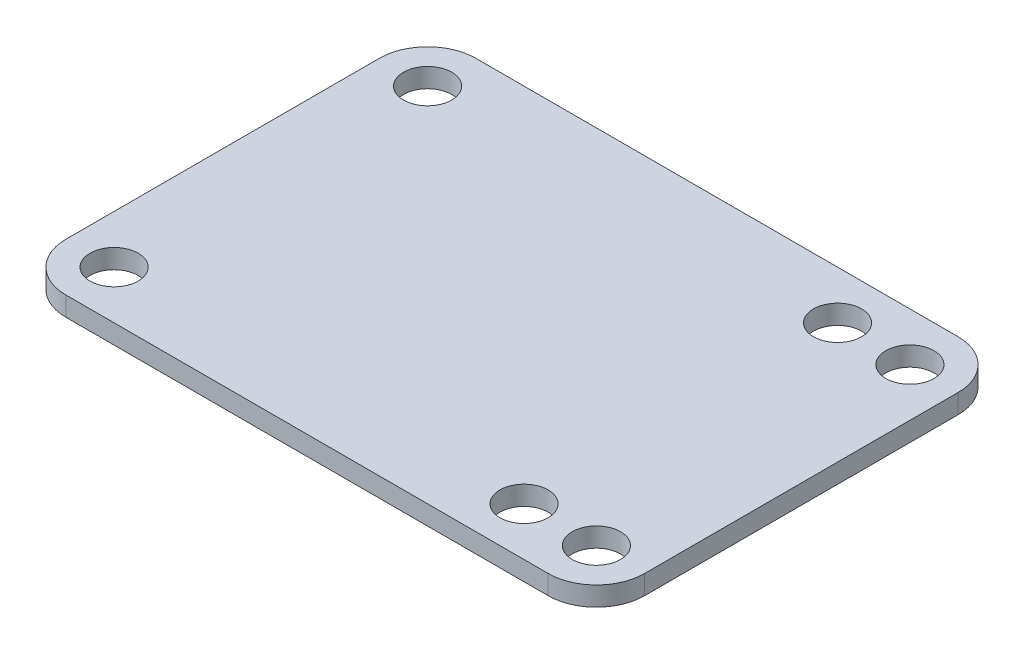
ISO-10303-21;
HEADER;
FILE_DESCRIPTION(('STEP AP214'),'2;1');
FILE_NAME('part.step','',(''),(''),'','','');
FILE_SCHEMA(('AUTOMOTIVE_DESIGN { 1 0 10303 214 1 1 1 1 }'));
ENDSEC;
DATA;
#1=APPLICATION_CONTEXT('core data for automotive mechanical design processes');
#2=APPLICATION_PROTOCOL_DEFINITION('international standard','automotive_design',2000,#1);
#3=PRODUCT_CONTEXT('',#1,'mechanical');
#4=PRODUCT('Part','Part','',(#3));
#5=PRODUCT_RELATED_PRODUCT_CATEGORY('part','',(#4));
#6=PRODUCT_DEFINITION_FORMATION('','',#4);
#7=PRODUCT_DEFINITION_CONTEXT('part definition',#1,'design');
#8=PRODUCT_DEFINITION('design','',#6,#7);
#9=PRODUCT_DEFINITION_SHAPE('','',#8);
#10=(LENGTH_UNIT() NAMED_UNIT(*) SI_UNIT(.MILLI.,.METRE.));
#11=(NAMED_UNIT(*) PLANE_ANGLE_UNIT() SI_UNIT($,.RADIAN.));
#12=(NAMED_UNIT(*) SI_UNIT($,.STERADIAN.) SOLID_ANGLE_UNIT());
#13=UNCERTAINTY_MEASURE_WITH_UNIT(LENGTH_MEASURE(1.E-05),#10,'distance_accuracy_value','');
#14=(GEOMETRIC_REPRESENTATION_CONTEXT(3) GLOBAL_UNCERTAINTY_ASSIGNED_CONTEXT((#13)) GLOBAL_UNIT_ASSIGNED_CONTEXT((#10,
#11,#12)) REPRESENTATION_CONTEXT('',''));
#15=CARTESIAN_POINT('',(0.,0.,0.));
#16=DIRECTION('',(0.,0.,1.));
#17=DIRECTION('',(1.,0.,0.));
#18=AXIS2_PLACEMENT_3D('',#15,#16,#17);
#19=CARTESIAN_POINT('',(-38.1,2.54,26.9875));
#20=DIRECTION('',(1.,0.,0.));
#21=DIRECTION('',(0.,0.,-1.));
#22=AXIS2_PLACEMENT_3D('',#19,#20,#21);
#23=PLANE('',#22);
#24=DIRECTION('',(0.,0.,1.));
#25=VECTOR('',#24,1.);
#26=CARTESIAN_POINT('',(-38.1,0.,26.9875));
#27=LINE('',#26,#25);
#28=CARTESIAN_POINT('',(-38.1,0.,-20.6375));
#29=VERTEX_POINT('',#28);
#30=CARTESIAN_POINT('',(-38.1,0.,20.6375));
#31=VERTEX_POINT('',#30);
#32=EDGE_CURVE('E126',#29,#31,#27,.T.);
#33=ORIENTED_EDGE('',*,*,#32,.T.);
#34=DIRECTION('',(0.,-1.,0.));
#35=VECTOR('',#34,1.);
#36=CARTESIAN_POINT('',(-38.1,2.54,20.6375));
#37=LINE('',#36,#35);
#38=CARTESIAN_POINT('',(-38.1,2.54,20.6375));
#39=VERTEX_POINT('',#38);
#40=EDGE_CURVE('E104',#31,#39,#37,.F.);
#41=ORIENTED_EDGE('',*,*,#40,.T.);
#42=DIRECTION('',(0.,0.,1.));
#43=VECTOR('',#42,1.);
#44=CARTESIAN_POINT('',(-38.1,2.54,26.9875));
#45=LINE('',#44,#43);
#46=CARTESIAN_POINT('',(-38.1,2.54,-20.6375));
#47=VERTEX_POINT('',#46);
#48=EDGE_CURVE('E136',#47,#39,#45,.T.);
#49=ORIENTED_EDGE('',*,*,#48,.F.);
#50=DIRECTION('',(0.,-1.,0.));
#51=VECTOR('',#50,1.);
#52=CARTESIAN_POINT('',(-38.1,2.54,-20.6375));
#53=LINE('',#52,#51);
#54=EDGE_CURVE('E109',#47,#29,#53,.T.);
#55=ORIENTED_EDGE('',*,*,#54,.T.);
#56=EDGE_LOOP('',(#33,#41,#49,#55));
#57=FACE_BOUND('',#56,.T.);
#58=ADVANCED_FACE('F33',(#57),#23,.F.);
#59=CARTESIAN_POINT('',(38.1,2.54,26.9875));
#60=DIRECTION('',(0.,0.,-1.));
#61=DIRECTION('',(-1.,0.,0.));
#62=AXIS2_PLACEMENT_3D('',#59,#60,#61);
#63=PLANE('',#62);
#64=DIRECTION('',(1.,0.,0.));
#65=VECTOR('',#64,1.);
#66=CARTESIAN_POINT('',(38.1,2.54,26.9875));
#67=LINE('',#66,#65);
#68=CARTESIAN_POINT('',(-31.75,2.54,26.9875));
#69=VERTEX_POINT('',#68);
#70=CARTESIAN_POINT('',(31.75,2.54,26.9875));
#71=VERTEX_POINT('',#70);
#72=EDGE_CURVE('E119',#69,#71,#67,.T.);
#73=ORIENTED_EDGE('',*,*,#72,.F.);
#74=DIRECTION('',(0.,-1.,0.));
#75=VECTOR('',#74,1.);
#76=CARTESIAN_POINT('',(-31.75,2.54,26.9875));
#77=LINE('',#76,#75);
#78=CARTESIAN_POINT('',(-31.75,0.,26.9875));
#79=VERTEX_POINT('',#78);
#80=EDGE_CURVE('E103',#69,#79,#77,.T.);
#81=ORIENTED_EDGE('',*,*,#80,.T.);
#82=DIRECTION('',(1.,0.,0.));
#83=VECTOR('',#82,1.);
#84=CARTESIAN_POINT('',(38.1,0.,26.9875));
#85=LINE('',#84,#83);
#86=CARTESIAN_POINT('',(31.75,0.,26.9875));
#87=VERTEX_POINT('',#86);
#88=EDGE_CURVE('E116',#79,#87,#85,.T.);
#89=ORIENTED_EDGE('',*,*,#88,.T.);
#90=DIRECTION('',(0.,-1.,0.));
#91=VECTOR('',#90,1.);
#92=CARTESIAN_POINT('',(31.75,2.54,26.9875));
#93=LINE('',#92,#91);
#94=EDGE_CURVE('E121',#87,#71,#93,.F.);
#95=ORIENTED_EDGE('',*,*,#94,.T.);
#96=EDGE_LOOP('',(#73,#81,#89,#95));
#97=FACE_BOUND('',#96,.T.);
#98=ADVANCED_FACE('F115',(#97),#63,.F.);
#99=CARTESIAN_POINT('',(38.1,2.54,-26.9875));
#100=DIRECTION('',(-1.,0.,0.));
#101=DIRECTION('',(0.,0.,1.));
#102=AXIS2_PLACEMENT_3D('',#99,#100,#101);
#103=PLANE('',#102);
#104=DIRECTION('',(0.,0.,-1.));
#105=VECTOR('',#104,1.);
#106=CARTESIAN_POINT('',(38.1,0.,-26.9875));
#107=LINE('',#106,#105);
#108=CARTESIAN_POINT('',(38.1,0.,20.6375));
#109=VERTEX_POINT('',#108);
#110=CARTESIAN_POINT('',(38.1,0.,-20.6375));
#111=VERTEX_POINT('',#110);
#112=EDGE_CURVE('E125',#109,#111,#107,.T.);
#113=ORIENTED_EDGE('',*,*,#112,.T.);
#114=DIRECTION('',(0.,-1.,0.));
#115=VECTOR('',#114,1.);
#116=CARTESIAN_POINT('',(38.1,2.54,-20.6375));
#117=LINE('',#116,#115);
#118=CARTESIAN_POINT('',(38.1,2.54,-20.6375));
#119=VERTEX_POINT('',#118);
#120=EDGE_CURVE('E11',#111,#119,#117,.F.);
#121=ORIENTED_EDGE('',*,*,#120,.T.);
#122=DIRECTION('',(0.,0.,-1.));
#123=VECTOR('',#122,1.);
#124=CARTESIAN_POINT('',(38.1,2.54,-26.9875));
#125=LINE('',#124,#123);
#126=CARTESIAN_POINT('',(38.1,2.54,20.6375));
#127=VERTEX_POINT('',#126);
#128=EDGE_CURVE('E162',#127,#119,#125,.T.);
#129=ORIENTED_EDGE('',*,*,#128,.F.);
#130=DIRECTION('',(0.,-1.,0.));
#131=VECTOR('',#130,1.);
#132=CARTESIAN_POINT('',(38.1,2.54,20.6375));
#133=LINE('',#132,#131);
#134=EDGE_CURVE('E41',#127,#109,#133,.T.);
#135=ORIENTED_EDGE('',*,*,#134,.T.);
#136=EDGE_LOOP('',(#113,#121,#129,#135));
#137=FACE_BOUND('',#136,.T.);
#138=ADVANCED_FACE('F160',(#137),#103,.F.);
#139=CARTESIAN_POINT('',(-38.1,2.54,-26.9875));
#140=DIRECTION('',(0.,0.,1.));
#141=DIRECTION('',(1.,0.,0.));
#142=AXIS2_PLACEMENT_3D('',#139,#140,#141);
#143=PLANE('',#142);
#144=DIRECTION('',(-1.,0.,0.));
#145=VECTOR('',#144,1.);
#146=CARTESIAN_POINT('',(-38.1,0.,-26.9875));
#147=LINE('',#146,#145);
#148=CARTESIAN_POINT('',(31.75,0.,-26.9875));
#149=VERTEX_POINT('',#148);
#150=CARTESIAN_POINT('',(-31.75,0.,-26.9875));
#151=VERTEX_POINT('',#150);
#152=EDGE_CURVE('E129',#149,#151,#147,.T.);
#153=ORIENTED_EDGE('',*,*,#152,.T.);
#154=DIRECTION('',(0.,-1.,0.));
#155=VECTOR('',#154,1.);
#156=CARTESIAN_POINT('',(-31.75,2.54,-26.9875));
#157=LINE('',#156,#155);
#158=CARTESIAN_POINT('',(-31.75,2.54,-26.9875));
#159=VERTEX_POINT('',#158);
#160=EDGE_CURVE('E48',#151,#159,#157,.F.);
#161=ORIENTED_EDGE('',*,*,#160,.T.);
#162=DIRECTION('',(-1.,0.,0.));
#163=VECTOR('',#162,1.);
#164=CARTESIAN_POINT('',(-38.1,2.54,-26.9875));
#165=LINE('',#164,#163);
#166=CARTESIAN_POINT('',(31.75,2.54,-26.9875));
#167=VERTEX_POINT('',#166);
#168=EDGE_CURVE('E137',#167,#159,#165,.T.);
#169=ORIENTED_EDGE('',*,*,#168,.F.);
#170=DIRECTION('',(0.,-1.,0.));
#171=VECTOR('',#170,1.);
#172=CARTESIAN_POINT('',(31.75,2.54,-26.9875));
#173=LINE('',#172,#171);
#174=EDGE_CURVE('E153',#167,#149,#173,.T.);
#175=ORIENTED_EDGE('',*,*,#174,.T.);
#176=EDGE_LOOP('',(#153,#161,#169,#175));
#177=FACE_BOUND('',#176,.T.);
#178=ADVANCED_FACE('F169',(#177),#143,.F.);
#179=CARTESIAN_POINT('',(0.,2.54,0.));
#180=DIRECTION('',(0.,-1.,0.));
#181=DIRECTION('',(0.,0.,-1.));
#182=AXIS2_PLACEMENT_3D('',#179,#180,#181);
#183=PLANE('',#182);
#184=CARTESIAN_POINT('',(31.75,2.54,-20.6375));
#185=DIRECTION('',(0.,-1.,0.));
#186=DIRECTION('',(0.,0.,-1.));
#187=AXIS2_PLACEMENT_3D('',#184,#185,#186);
#188=CIRCLE('',#187,3.175);
#189=CARTESIAN_POINT('',(31.75,2.54,-23.8125));
#190=VERTEX_POINT('',#189);
#191=EDGE_CURVE('E131',#190,#190,#188,.T.);
#192=ORIENTED_EDGE('',*,*,#191,.T.);
#193=EDGE_LOOP('',(#192));
#194=FACE_BOUND('',#193,.T.);
#195=CARTESIAN_POINT('',(22.225,2.54,-20.6375));
#196=DIRECTION('',(0.,-1.,0.));
#197=DIRECTION('',(0.,0.,-1.));
#198=AXIS2_PLACEMENT_3D('',#195,#196,#197);
#199=CIRCLE('',#198,3.175);
#200=CARTESIAN_POINT('',(22.225,2.54,-23.8125));
#201=VERTEX_POINT('',#200);
#202=EDGE_CURVE('E178',#201,#201,#199,.T.);
#203=ORIENTED_EDGE('',*,*,#202,.T.);
#204=EDGE_LOOP('',(#203));
#205=FACE_BOUND('',#204,.T.);
#206=CARTESIAN_POINT('',(-31.75,2.54,-20.6375));
#207=DIRECTION('',(0.,-1.,0.));
#208=DIRECTION('',(0.,0.,-1.));
#209=AXIS2_PLACEMENT_3D('',#206,#207,#208);
#210=CIRCLE('',#209,3.175);
#211=CARTESIAN_POINT('',(-31.75,2.54,-23.8125));
#212=VERTEX_POINT('',#211);
#213=EDGE_CURVE('E181',#212,#212,#210,.T.);
#214=ORIENTED_EDGE('',*,*,#213,.T.);
#215=EDGE_LOOP('',(#214));
#216=FACE_BOUND('',#215,.T.);
#217=CARTESIAN_POINT('',(-31.75,2.54,20.6375));
#218=DIRECTION('',(0.,-1.,0.));
#219=DIRECTION('',(0.,0.,-1.));
#220=AXIS2_PLACEMENT_3D('',#217,#218,#219);
#221=CIRCLE('',#220,3.175);
#222=CARTESIAN_POINT('',(-31.75,2.54,17.4625));
#223=VERTEX_POINT('',#222);
#224=EDGE_CURVE('E184',#223,#223,#221,.T.);
#225=ORIENTED_EDGE('',*,*,#224,.T.);
#226=EDGE_LOOP('',(#225));
#227=FACE_BOUND('',#226,.T.);
#228=CARTESIAN_POINT('',(22.225,2.54,20.6375));
#229=DIRECTION('',(0.,-1.,0.));
#230=DIRECTION('',(0.,0.,-1.));
#231=AXIS2_PLACEMENT_3D('',#228,#229,#230);
#232=CIRCLE('',#231,3.175);
#233=CARTESIAN_POINT('',(22.225,2.54,17.4625));
#234=VERTEX_POINT('',#233);
#235=EDGE_CURVE('E187',#234,#234,#232,.T.);
#236=ORIENTED_EDGE('',*,*,#235,.T.);
#237=EDGE_LOOP('',(#236));
#238=FACE_BOUND('',#237,.T.);
#239=CARTESIAN_POINT('',(31.75,2.54,20.6375));
#240=DIRECTION('',(0.,-1.,0.));
#241=DIRECTION('',(0.,0.,-1.));
#242=AXIS2_PLACEMENT_3D('',#239,#240,#241);
#243=CIRCLE('',#242,3.175);
#244=CARTESIAN_POINT('',(31.75,2.54,17.4625));
#245=VERTEX_POINT('',#244);
#246=EDGE_CURVE('E190',#245,#245,#243,.T.);
#247=ORIENTED_EDGE('',*,*,#246,.T.);
#248=EDGE_LOOP('',(#247));
#249=FACE_BOUND('',#248,.T.);
#250=ORIENTED_EDGE('',*,*,#48,.T.);
#251=CARTESIAN_POINT('',(-31.75,2.54,20.6375));
#252=DIRECTION('',(0.,-1.,0.));
#253=DIRECTION('',(0.,0.,-1.));
#254=AXIS2_PLACEMENT_3D('',#251,#252,#253);
#255=CIRCLE('',#254,6.35);
#256=EDGE_CURVE('E151',#39,#69,#255,.F.);
#257=ORIENTED_EDGE('',*,*,#256,.T.);
#258=ORIENTED_EDGE('',*,*,#72,.T.);
#259=CARTESIAN_POINT('',(31.75,2.54,20.6375));
#260=DIRECTION('',(0.,-1.,0.));
#261=DIRECTION('',(0.,0.,-1.));
#262=AXIS2_PLACEMENT_3D('',#259,#260,#261);
#263=CIRCLE('',#262,6.35);
#264=EDGE_CURVE('E146',#71,#127,#263,.F.);
#265=ORIENTED_EDGE('',*,*,#264,.T.);
#266=ORIENTED_EDGE('',*,*,#128,.T.);
#267=CARTESIAN_POINT('',(31.75,2.54,-20.6375));
#268=DIRECTION('',(0.,-1.,0.));
#269=DIRECTION('',(0.,0.,-1.));
#270=AXIS2_PLACEMENT_3D('',#267,#268,#269);
#271=CIRCLE('',#270,6.35);
#272=EDGE_CURVE('E55',#119,#167,#271,.F.);
#273=ORIENTED_EDGE('',*,*,#272,.T.);
#274=ORIENTED_EDGE('',*,*,#168,.T.);
#275=CARTESIAN_POINT('',(-31.75,2.54,-20.6375));
#276=DIRECTION('',(0.,-1.,0.));
#277=DIRECTION('',(0.,0.,-1.));
#278=AXIS2_PLACEMENT_3D('',#275,#276,#277);
#279=CIRCLE('',#278,6.35);
#280=EDGE_CURVE('E149',#159,#47,#279,.F.);
#281=ORIENTED_EDGE('',*,*,#280,.T.);
#282=EDGE_LOOP('',(#250,#257,#258,#265,#266,#273,#274,#281));
#283=FACE_BOUND('',#282,.T.);
#284=ADVANCED_FACE('F222',(#194,#205,#216,#227,#238,#249,#283),#183,.F.);
#285=CARTESIAN_POINT('',(0.,0.,0.));
#286=DIRECTION('',(0.,-1.,0.));
#287=DIRECTION('',(0.,0.,-1.));
#288=AXIS2_PLACEMENT_3D('',#285,#286,#287);
#289=PLANE('',#288);
#290=CARTESIAN_POINT('',(31.75,0.,-20.6375));
#291=DIRECTION('',(0.,1.,0.));
#292=DIRECTION('',(0.,0.,1.));
#293=AXIS2_PLACEMENT_3D('',#290,#291,#292);
#294=CIRCLE('',#293,3.175);
#295=CARTESIAN_POINT('',(31.75,0.,-17.4625));
#296=VERTEX_POINT('',#295);
#297=EDGE_CURVE('E197',#296,#296,#294,.T.);
#298=ORIENTED_EDGE('',*,*,#297,.T.);
#299=EDGE_LOOP('',(#298));
#300=FACE_BOUND('',#299,.T.);
#301=CARTESIAN_POINT('',(22.225,0.,-20.6375));
#302=DIRECTION('',(0.,1.,0.));
#303=DIRECTION('',(0.,0.,1.));
#304=AXIS2_PLACEMENT_3D('',#301,#302,#303);
#305=CIRCLE('',#304,3.175);
#306=CARTESIAN_POINT('',(22.225,0.,-17.4625));
#307=VERTEX_POINT('',#306);
#308=EDGE_CURVE('E200',#307,#307,#305,.T.);
#309=ORIENTED_EDGE('',*,*,#308,.T.);
#310=EDGE_LOOP('',(#309));
#311=FACE_BOUND('',#310,.T.);
#312=CARTESIAN_POINT('',(-31.75,0.,-20.6375));
#313=DIRECTION('',(0.,1.,0.));
#314=DIRECTION('',(0.,0.,1.));
#315=AXIS2_PLACEMENT_3D('',#312,#313,#314);
#316=CIRCLE('',#315,3.175);
#317=CARTESIAN_POINT('',(-31.75,0.,-17.4625));
#318=VERTEX_POINT('',#317);
#319=EDGE_CURVE('E203',#318,#318,#316,.T.);
#320=ORIENTED_EDGE('',*,*,#319,.T.);
#321=EDGE_LOOP('',(#320));
#322=FACE_BOUND('',#321,.T.);
#323=CARTESIAN_POINT('',(-31.75,0.,20.6375));
#324=DIRECTION('',(0.,1.,0.));
#325=DIRECTION('',(0.,0.,1.));
#326=AXIS2_PLACEMENT_3D('',#323,#324,#325);
#327=CIRCLE('',#326,3.175);
#328=CARTESIAN_POINT('',(-31.75,0.,23.8125));
#329=VERTEX_POINT('',#328);
#330=EDGE_CURVE('E206',#329,#329,#327,.T.);
#331=ORIENTED_EDGE('',*,*,#330,.T.);
#332=EDGE_LOOP('',(#331));
#333=FACE_BOUND('',#332,.T.);
#334=CARTESIAN_POINT('',(22.225,0.,20.6375));
#335=DIRECTION('',(0.,1.,0.));
#336=DIRECTION('',(0.,0.,1.));
#337=AXIS2_PLACEMENT_3D('',#334,#335,#336);
#338=CIRCLE('',#337,3.175);
#339=CARTESIAN_POINT('',(22.225,0.,23.8125));
#340=VERTEX_POINT('',#339);
#341=EDGE_CURVE('E196',#340,#340,#338,.T.);
#342=ORIENTED_EDGE('',*,*,#341,.T.);
#343=EDGE_LOOP('',(#342));
#344=FACE_BOUND('',#343,.T.);
#345=CARTESIAN_POINT('',(31.75,0.,20.6375));
#346=DIRECTION('',(0.,1.,0.));
#347=DIRECTION('',(0.,0.,1.));
#348=AXIS2_PLACEMENT_3D('',#345,#346,#347);
#349=CIRCLE('',#348,3.175);
#350=CARTESIAN_POINT('',(31.75,0.,23.8125));
#351=VERTEX_POINT('',#350);
#352=EDGE_CURVE('E193',#351,#351,#349,.T.);
#353=ORIENTED_EDGE('',*,*,#352,.T.);
#354=EDGE_LOOP('',(#353));
#355=FACE_BOUND('',#354,.T.);
#356=ORIENTED_EDGE('',*,*,#88,.F.);
#357=CARTESIAN_POINT('',(-31.75,0.,20.6375));
#358=DIRECTION('',(0.,-1.,0.));
#359=DIRECTION('',(0.,0.,-1.));
#360=AXIS2_PLACEMENT_3D('',#357,#358,#359);
#361=CIRCLE('',#360,6.35);
#362=EDGE_CURVE('E99',#79,#31,#361,.T.);
#363=ORIENTED_EDGE('',*,*,#362,.T.);
#364=ORIENTED_EDGE('',*,*,#32,.F.);
#365=CARTESIAN_POINT('',(-31.75,0.,-20.6375));
#366=DIRECTION('',(0.,-1.,0.));
#367=DIRECTION('',(0.,0.,-1.));
#368=AXIS2_PLACEMENT_3D('',#365,#366,#367);
#369=CIRCLE('',#368,6.35);
#370=EDGE_CURVE('E110',#29,#151,#369,.T.);
#371=ORIENTED_EDGE('',*,*,#370,.T.);
#372=ORIENTED_EDGE('',*,*,#152,.F.);
#373=CARTESIAN_POINT('',(31.75,0.,-20.6375));
#374=DIRECTION('',(0.,-1.,0.));
#375=DIRECTION('',(0.,0.,-1.));
#376=AXIS2_PLACEMENT_3D('',#373,#374,#375);
#377=CIRCLE('',#376,6.35);
#378=EDGE_CURVE('E140',#149,#111,#377,.T.);
#379=ORIENTED_EDGE('',*,*,#378,.T.);
#380=ORIENTED_EDGE('',*,*,#112,.F.);
#381=CARTESIAN_POINT('',(31.75,0.,20.6375));
#382=DIRECTION('',(0.,-1.,0.));
#383=DIRECTION('',(0.,0.,-1.));
#384=AXIS2_PLACEMENT_3D('',#381,#382,#383);
#385=CIRCLE('',#384,6.35);
#386=EDGE_CURVE('E120',#109,#87,#385,.T.);
#387=ORIENTED_EDGE('',*,*,#386,.T.);
#388=EDGE_LOOP('',(#356,#363,#364,#371,#372,#379,#380,#387));
#389=FACE_BOUND('',#388,.T.);
#390=ADVANCED_FACE('F123',(#300,#311,#322,#333,#344,#355,#389),#289,.T.);
#391=CARTESIAN_POINT('',(31.75,0.,20.6375));
#392=DIRECTION('',(0.,1.,0.));
#393=DIRECTION('',(0.,0.,1.));
#394=AXIS2_PLACEMENT_3D('',#391,#392,#393);
#395=CYLINDRICAL_SURFACE('',#394,3.175);
#396=ORIENTED_EDGE('',*,*,#352,.F.);
#397=EDGE_LOOP('',(#396));
#398=FACE_BOUND('',#397,.T.);
#399=ORIENTED_EDGE('',*,*,#246,.F.);
#400=EDGE_LOOP('',(#399));
#401=FACE_BOUND('',#400,.T.);
#402=ADVANCED_FACE('F218',(#398,#401),#395,.F.);
#403=CARTESIAN_POINT('',(22.225,0.,20.6375));
#404=DIRECTION('',(0.,1.,0.));
#405=DIRECTION('',(0.,0.,1.));
#406=AXIS2_PLACEMENT_3D('',#403,#404,#405);
#407=CYLINDRICAL_SURFACE('',#406,3.175);
#408=ORIENTED_EDGE('',*,*,#341,.F.);
#409=EDGE_LOOP('',(#408));
#410=FACE_BOUND('',#409,.T.);
#411=ORIENTED_EDGE('',*,*,#235,.F.);
#412=EDGE_LOOP('',(#411));
#413=FACE_BOUND('',#412,.T.);
#414=ADVANCED_FACE('F214',(#410,#413),#407,.F.);
#415=CARTESIAN_POINT('',(-31.75,0.,20.6375));
#416=DIRECTION('',(0.,1.,0.));
#417=DIRECTION('',(0.,0.,1.));
#418=AXIS2_PLACEMENT_3D('',#415,#416,#417);
#419=CYLINDRICAL_SURFACE('',#418,3.175);
#420=ORIENTED_EDGE('',*,*,#330,.F.);
#421=EDGE_LOOP('',(#420));
#422=FACE_BOUND('',#421,.T.);
#423=ORIENTED_EDGE('',*,*,#224,.F.);
#424=EDGE_LOOP('',(#423));
#425=FACE_BOUND('',#424,.T.);
#426=ADVANCED_FACE('F217',(#422,#425),#419,.F.);
#427=CARTESIAN_POINT('',(-31.75,0.,-20.6375));
#428=DIRECTION('',(0.,1.,0.));
#429=DIRECTION('',(0.,0.,1.));
#430=AXIS2_PLACEMENT_3D('',#427,#428,#429);
#431=CYLINDRICAL_SURFACE('',#430,3.175);
#432=ORIENTED_EDGE('',*,*,#319,.F.);
#433=EDGE_LOOP('',(#432));
#434=FACE_BOUND('',#433,.T.);
#435=ORIENTED_EDGE('',*,*,#213,.F.);
#436=EDGE_LOOP('',(#435));
#437=FACE_BOUND('',#436,.T.);
#438=ADVANCED_FACE('F264',(#434,#437),#431,.F.);
#439=CARTESIAN_POINT('',(22.225,0.,-20.6375));
#440=DIRECTION('',(0.,1.,0.));
#441=DIRECTION('',(0.,0.,1.));
#442=AXIS2_PLACEMENT_3D('',#439,#440,#441);
#443=CYLINDRICAL_SURFACE('',#442,3.175);
#444=ORIENTED_EDGE('',*,*,#308,.F.);
#445=EDGE_LOOP('',(#444));
#446=FACE_BOUND('',#445,.T.);
#447=ORIENTED_EDGE('',*,*,#202,.F.);
#448=EDGE_LOOP('',(#447));
#449=FACE_BOUND('',#448,.T.);
#450=ADVANCED_FACE('F260',(#446,#449),#443,.F.);
#451=CARTESIAN_POINT('',(31.75,0.,-20.6375));
#452=DIRECTION('',(0.,1.,0.));
#453=DIRECTION('',(0.,0.,1.));
#454=AXIS2_PLACEMENT_3D('',#451,#452,#453);
#455=CYLINDRICAL_SURFACE('',#454,3.175);
#456=ORIENTED_EDGE('',*,*,#297,.F.);
#457=EDGE_LOOP('',(#456));
#458=FACE_BOUND('',#457,.T.);
#459=ORIENTED_EDGE('',*,*,#191,.F.);
#460=EDGE_LOOP('',(#459));
#461=FACE_BOUND('',#460,.T.);
#462=ADVANCED_FACE('F239',(#458,#461),#455,.F.);
#463=CARTESIAN_POINT('',(-31.75,2.54,20.6375));
#464=DIRECTION('',(0.,-1.,0.));
#465=DIRECTION('',(0.,0.,-1.));
#466=AXIS2_PLACEMENT_3D('',#463,#464,#465);
#467=CYLINDRICAL_SURFACE('',#466,6.35);
#468=ORIENTED_EDGE('',*,*,#256,.F.);
#469=ORIENTED_EDGE('',*,*,#40,.F.);
#470=ORIENTED_EDGE('',*,*,#362,.F.);
#471=ORIENTED_EDGE('',*,*,#80,.F.);
#472=EDGE_LOOP('',(#468,#469,#470,#471));
#473=FACE_BOUND('',#472,.T.);
#474=ADVANCED_FACE('F102',(#473),#467,.T.);
#475=CARTESIAN_POINT('',(-31.75,2.54,-20.6375));
#476=DIRECTION('',(0.,-1.,0.));
#477=DIRECTION('',(0.,0.,-1.));
#478=AXIS2_PLACEMENT_3D('',#475,#476,#477);
#479=CYLINDRICAL_SURFACE('',#478,6.35);
#480=ORIENTED_EDGE('',*,*,#280,.F.);
#481=ORIENTED_EDGE('',*,*,#160,.F.);
#482=ORIENTED_EDGE('',*,*,#370,.F.);
#483=ORIENTED_EDGE('',*,*,#54,.F.);
#484=EDGE_LOOP('',(#480,#481,#482,#483));
#485=FACE_BOUND('',#484,.T.);
#486=ADVANCED_FACE('F232',(#485),#479,.T.);
#487=CARTESIAN_POINT('',(31.75,2.54,-20.6375));
#488=DIRECTION('',(0.,-1.,0.));
#489=DIRECTION('',(0.,0.,-1.));
#490=AXIS2_PLACEMENT_3D('',#487,#488,#489);
#491=CYLINDRICAL_SURFACE('',#490,6.35);
#492=ORIENTED_EDGE('',*,*,#272,.F.);
#493=ORIENTED_EDGE('',*,*,#120,.F.);
#494=ORIENTED_EDGE('',*,*,#378,.F.);
#495=ORIENTED_EDGE('',*,*,#174,.F.);
#496=EDGE_LOOP('',(#492,#493,#494,#495));
#497=FACE_BOUND('',#496,.T.);
#498=ADVANCED_FACE('F168',(#497),#491,.T.);
#499=CARTESIAN_POINT('',(31.75,2.54,20.6375));
#500=DIRECTION('',(0.,-1.,0.));
#501=DIRECTION('',(0.,0.,-1.));
#502=AXIS2_PLACEMENT_3D('',#499,#500,#501);
#503=CYLINDRICAL_SURFACE('',#502,6.35);
#504=ORIENTED_EDGE('',*,*,#264,.F.);
#505=ORIENTED_EDGE('',*,*,#94,.F.);
#506=ORIENTED_EDGE('',*,*,#386,.F.);
#507=ORIENTED_EDGE('',*,*,#134,.F.);
#508=EDGE_LOOP('',(#504,#505,#506,#507));
#509=FACE_BOUND('',#508,.T.);
#510=ADVANCED_FACE('F35',(#509),#503,.T.);
#511=CLOSED_SHELL('',(#58,#98,#138,#178,#284,#390,#402,#414,#426,#438,#450,#462,#474,#486,#498,#510));
#512=MANIFOLD_SOLID_BREP('B2',#511);
#513=ADVANCED_BREP_SHAPE_REPRESENTATION('',(#18,#512),#14);
#514=SHAPE_DEFINITION_REPRESENTATION(#9,#513);
ENDSEC;
END-ISO-10303-21;
